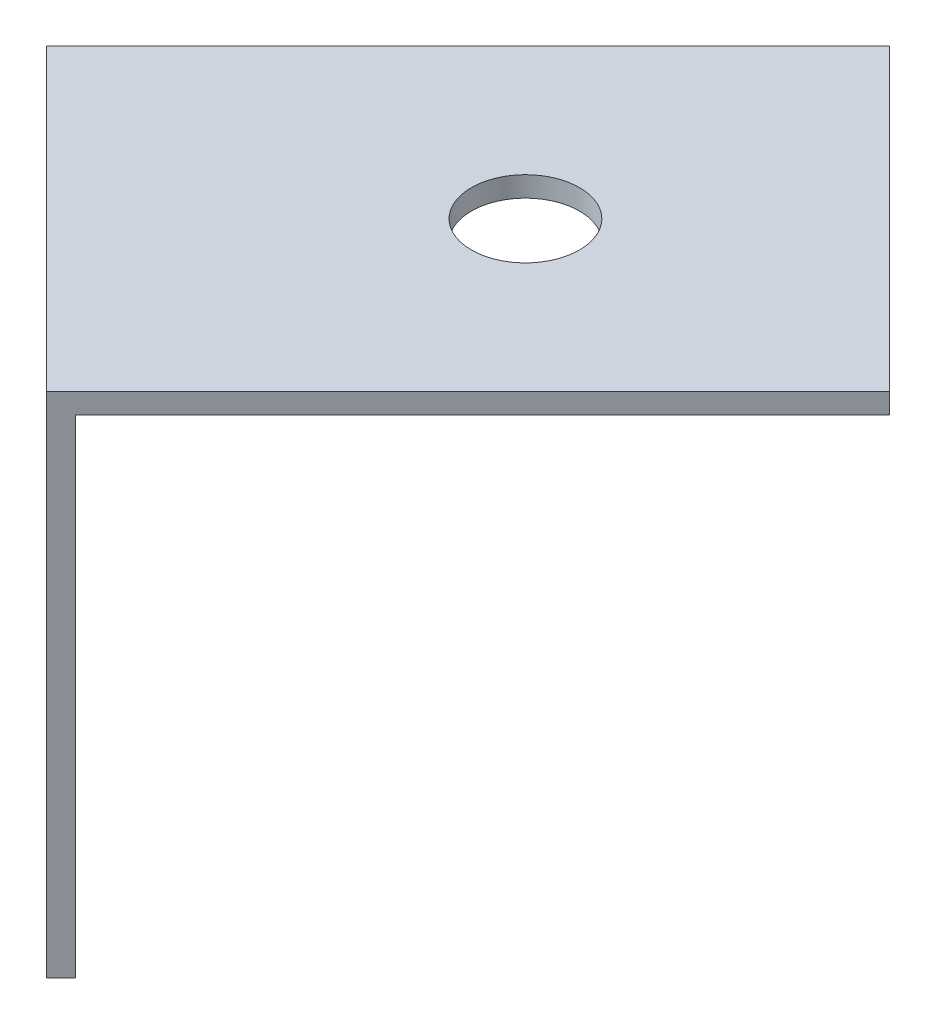
ISO-10303-21;
HEADER;
FILE_DESCRIPTION(('STEP AP214'),'2;1');
FILE_NAME('part.step','',(''),(''),'','','');
FILE_SCHEMA(('AUTOMOTIVE_DESIGN { 1 0 10303 214 1 1 1 1 }'));
ENDSEC;
DATA;
#1=APPLICATION_CONTEXT('core data for automotive mechanical design processes');
#2=APPLICATION_PROTOCOL_DEFINITION('international standard','automotive_design',2000,#1);
#3=PRODUCT_CONTEXT('',#1,'mechanical');
#4=PRODUCT('Part','Part','',(#3));
#5=PRODUCT_RELATED_PRODUCT_CATEGORY('part','',(#4));
#6=PRODUCT_DEFINITION_FORMATION('','',#4);
#7=PRODUCT_DEFINITION_CONTEXT('part definition',#1,'design');
#8=PRODUCT_DEFINITION('design','',#6,#7);
#9=PRODUCT_DEFINITION_SHAPE('','',#8);
#10=(LENGTH_UNIT() NAMED_UNIT(*) SI_UNIT(.MILLI.,.METRE.));
#11=(NAMED_UNIT(*) PLANE_ANGLE_UNIT() SI_UNIT($,.RADIAN.));
#12=(NAMED_UNIT(*) SI_UNIT($,.STERADIAN.) SOLID_ANGLE_UNIT());
#13=UNCERTAINTY_MEASURE_WITH_UNIT(LENGTH_MEASURE(1.E-05),#10,'distance_accuracy_value','');
#14=(GEOMETRIC_REPRESENTATION_CONTEXT(3) GLOBAL_UNCERTAINTY_ASSIGNED_CONTEXT((#13)) GLOBAL_UNIT_ASSIGNED_CONTEXT((#10,
#11,#12)) REPRESENTATION_CONTEXT('',''));
#15=CARTESIAN_POINT('',(0.,0.,0.));
#16=DIRECTION('',(0.,0.,1.));
#17=DIRECTION('',(1.,0.,0.));
#18=AXIS2_PLACEMENT_3D('',#15,#16,#17);
#19=CARTESIAN_POINT('',(-21.7788888605454,0.,21.7788888605459));
#20=DIRECTION('',(-0.707106781186539,0.,0.707106781186556));
#21=DIRECTION('',(0.707106781186556,0.,0.707106781186539));
#22=AXIS2_PLACEMENT_3D('',#19,#20,#21);
#23=PLANE('',#22);
#24=DIRECTION('',(-0.707106781186556,0.,-0.707106781186539));
#25=VECTOR('',#24,1.);
#26=CARTESIAN_POINT('',(-30.6177236253827,-74.2,12.9400540957089));
#27=LINE('',#26,#25);
#28=CARTESIAN_POINT('',(-12.9400540957187,-74.2,30.6177236253724));
#29=VERTEX_POINT('',#28);
#30=CARTESIAN_POINT('',(-30.6177236253827,-74.2,12.9400540957089));
#31=VERTEX_POINT('',#30);
#32=EDGE_CURVE('E52',#29,#31,#27,.T.);
#33=ORIENTED_EDGE('',*,*,#32,.F.);
#34=DIRECTION('',(0.,-1.,0.));
#35=VECTOR('',#34,1.);
#36=CARTESIAN_POINT('',(-12.9400540957187,-73.,30.6177236253724));
#37=LINE('',#36,#35);
#38=CARTESIAN_POINT('',(-12.9400540957188,-103.,30.6177236253723));
#39=VERTEX_POINT('',#38);
#40=EDGE_CURVE('E57',#29,#39,#37,.T.);
#41=ORIENTED_EDGE('',*,*,#40,.T.);
#42=DIRECTION('',(0.707106781186556,0.,0.707106781186539));
#43=VECTOR('',#42,1.);
#44=CARTESIAN_POINT('',(-30.6177236253827,-103.,12.9400540957089));
#45=LINE('',#44,#43);
#46=CARTESIAN_POINT('',(-30.6177236253827,-103.,12.9400540957089));
#47=VERTEX_POINT('',#46);
#48=EDGE_CURVE('E114',#47,#39,#45,.T.);
#49=ORIENTED_EDGE('',*,*,#48,.F.);
#50=DIRECTION('',(0.,-1.,0.));
#51=VECTOR('',#50,1.);
#52=CARTESIAN_POINT('',(-30.6177236253827,-73.,12.9400540957089));
#53=LINE('',#52,#51);
#54=EDGE_CURVE('E96',#31,#47,#53,.T.);
#55=ORIENTED_EDGE('',*,*,#54,.F.);
#56=EDGE_LOOP('',(#33,#41,#49,#55));
#57=FACE_BOUND('',#56,.T.);
#58=ADVANCED_FACE('F35',(#57),#23,.F.);
#59=CARTESIAN_POINT('',(-12.9400540957187,-73.,30.6177236253724));
#60=DIRECTION('',(0.,1.,0.));
#61=DIRECTION('',(0.,0.,1.));
#62=AXIS2_PLACEMENT_3D('',#59,#60,#61);
#63=PLANE('',#62);
#64=CARTESIAN_POINT('',(-8.48528137424377,-73.,8.48528137423338));
#65=DIRECTION('',(0.,1.,0.));
#66=DIRECTION('',(0.,0.,1.));
#67=AXIS2_PLACEMENT_3D('',#64,#65,#66);
#68=CIRCLE('',#67,3.19266946109404);
#69=CARTESIAN_POINT('',(-8.48528137424377,-73.,11.6779508353274));
#70=VERTEX_POINT('',#69);
#71=EDGE_CURVE('E132',#70,#70,#68,.T.);
#72=ORIENTED_EDGE('',*,*,#71,.F.);
#73=EDGE_LOOP('',(#72));
#74=FACE_BOUND('',#73,.T.);
#75=DIRECTION('',(-0.707106781186556,0.,-0.707106781186539));
#76=VECTOR('',#75,1.);
#77=CARTESIAN_POINT('',(-13.7885822331426,-73.,31.4662517627962));
#78=LINE('',#77,#76);
#79=CARTESIAN_POINT('',(-13.7885822331426,-73.,31.4662517627962));
#80=VERTEX_POINT('',#79);
#81=CARTESIAN_POINT('',(-31.4662517628065,-73.,13.7885822331328));
#82=VERTEX_POINT('',#81);
#83=EDGE_CURVE('E93',#80,#82,#78,.T.);
#84=ORIENTED_EDGE('',*,*,#83,.F.);
#85=DIRECTION('',(-0.707106781186539,0.,0.707106781186556));
#86=VECTOR('',#85,1.);
#87=CARTESIAN_POINT('',(-12.9400540957187,-73.,30.6177236253724));
#88=LINE('',#87,#86);
#89=CARTESIAN_POINT('',(11.1015764646236,-73.,6.57609306502946));
#90=VERTEX_POINT('',#89);
#91=EDGE_CURVE('E11',#90,#80,#88,.T.);
#92=ORIENTED_EDGE('',*,*,#91,.F.);
#93=DIRECTION('',(0.707106781186556,0.,0.707106781186539));
#94=VECTOR('',#93,1.);
#95=CARTESIAN_POINT('',(-6.57609306504033,-73.,-11.101576464634));
#96=LINE('',#95,#94);
#97=CARTESIAN_POINT('',(-6.57609306504033,-73.,-11.101576464634));
#98=VERTEX_POINT('',#97);
#99=EDGE_CURVE('E128',#98,#90,#96,.T.);
#100=ORIENTED_EDGE('',*,*,#99,.F.);
#101=DIRECTION('',(-0.707106781186539,0.,0.707106781186556));
#102=VECTOR('',#101,1.);
#103=CARTESIAN_POINT('',(-30.6177236253827,-73.,12.9400540957089));
#104=LINE('',#103,#102);
#105=EDGE_CURVE('E99',#98,#82,#104,.T.);
#106=ORIENTED_EDGE('',*,*,#105,.T.);
#107=EDGE_LOOP('',(#84,#92,#100,#106));
#108=FACE_BOUND('',#107,.T.);
#109=ADVANCED_FACE('F37',(#74,#108),#63,.T.);
#110=CARTESIAN_POINT('',(-12.9400540957187,-73.,30.6177236253724));
#111=DIRECTION('',(-0.707106781186556,0.,-0.707106781186539));
#112=DIRECTION('',(-0.707106781186539,0.,0.707106781186556));
#113=AXIS2_PLACEMENT_3D('',#110,#111,#112);
#114=PLANE('',#113);
#115=DIRECTION('',(0.,-1.,0.));
#116=VECTOR('',#115,1.);
#117=CARTESIAN_POINT('',(-13.7885822331426,-73.,31.4662517627962));
#118=LINE('',#117,#116);
#119=CARTESIAN_POINT('',(-13.7885822331426,-103.,31.4662517627962));
#120=VERTEX_POINT('',#119);
#121=EDGE_CURVE('E79',#80,#120,#118,.T.);
#122=ORIENTED_EDGE('',*,*,#121,.T.);
#123=DIRECTION('',(-0.707106781186539,0.,0.707106781186556));
#124=VECTOR('',#123,1.);
#125=CARTESIAN_POINT('',(-12.9400540957188,-103.,30.6177236253723));
#126=LINE('',#125,#124);
#127=EDGE_CURVE('E44',#39,#120,#126,.T.);
#128=ORIENTED_EDGE('',*,*,#127,.F.);
#129=ORIENTED_EDGE('',*,*,#40,.F.);
#130=DIRECTION('',(-0.707106781186539,0.,0.707106781186556));
#131=VECTOR('',#130,1.);
#132=CARTESIAN_POINT('',(11.1015764646236,-74.2,6.57609306502947));
#133=LINE('',#132,#131);
#134=CARTESIAN_POINT('',(11.1015764646236,-74.2,6.57609306502947));
#135=VERTEX_POINT('',#134);
#136=EDGE_CURVE('E102',#135,#29,#133,.T.);
#137=ORIENTED_EDGE('',*,*,#136,.F.);
#138=DIRECTION('',(0.,-1.,0.));
#139=VECTOR('',#138,1.);
#140=CARTESIAN_POINT('',(11.1015764646236,-73.,6.57609306502946));
#141=LINE('',#140,#139);
#142=EDGE_CURVE('E84',#90,#135,#141,.T.);
#143=ORIENTED_EDGE('',*,*,#142,.F.);
#144=ORIENTED_EDGE('',*,*,#91,.T.);
#145=EDGE_LOOP('',(#122,#128,#129,#137,#143,#144));
#146=FACE_BOUND('',#145,.T.);
#147=ADVANCED_FACE('F78',(#146),#114,.F.);
#148=CARTESIAN_POINT('',(-30.6177236253827,-103.,12.9400540957089));
#149=DIRECTION('',(0.,-1.,0.));
#150=DIRECTION('',(0.,0.,-1.));
#151=AXIS2_PLACEMENT_3D('',#148,#149,#150);
#152=PLANE('',#151);
#153=DIRECTION('',(0.707106781186556,0.,0.707106781186539));
#154=VECTOR('',#153,1.);
#155=CARTESIAN_POINT('',(-31.4662517628065,-103.,13.7885822331327));
#156=LINE('',#155,#154);
#157=CARTESIAN_POINT('',(-31.4662517628065,-103.,13.7885822331327));
#158=VERTEX_POINT('',#157);
#159=EDGE_CURVE('E95',#158,#120,#156,.T.);
#160=ORIENTED_EDGE('',*,*,#159,.F.);
#161=DIRECTION('',(-0.707106781186539,0.,0.707106781186556));
#162=VECTOR('',#161,1.);
#163=CARTESIAN_POINT('',(-30.6177236253827,-103.,12.9400540957089));
#164=LINE('',#163,#162);
#165=EDGE_CURVE('E113',#47,#158,#164,.T.);
#166=ORIENTED_EDGE('',*,*,#165,.F.);
#167=ORIENTED_EDGE('',*,*,#48,.T.);
#168=ORIENTED_EDGE('',*,*,#127,.T.);
#169=EDGE_LOOP('',(#160,#166,#167,#168));
#170=FACE_BOUND('',#169,.T.);
#171=ADVANCED_FACE('F164',(#170),#152,.T.);
#172=CARTESIAN_POINT('',(-30.6177236253827,-73.,12.9400540957089));
#173=DIRECTION('',(-0.707106781186556,0.,-0.707106781186539));
#174=DIRECTION('',(-0.707106781186539,0.,0.707106781186556));
#175=AXIS2_PLACEMENT_3D('',#172,#173,#174);
#176=PLANE('',#175);
#177=DIRECTION('',(0.,-1.,0.));
#178=VECTOR('',#177,1.);
#179=CARTESIAN_POINT('',(-31.4662517628065,-73.,13.7885822331328));
#180=LINE('',#179,#178);
#181=EDGE_CURVE('E101',#82,#158,#180,.T.);
#182=ORIENTED_EDGE('',*,*,#181,.F.);
#183=ORIENTED_EDGE('',*,*,#105,.F.);
#184=DIRECTION('',(0.,1.,0.));
#185=VECTOR('',#184,1.);
#186=CARTESIAN_POINT('',(-6.57609306504033,-73.,-11.101576464634));
#187=LINE('',#186,#185);
#188=CARTESIAN_POINT('',(-6.57609306504033,-74.2,-11.101576464634));
#189=VERTEX_POINT('',#188);
#190=EDGE_CURVE('E124',#189,#98,#187,.T.);
#191=ORIENTED_EDGE('',*,*,#190,.F.);
#192=DIRECTION('',(-0.707106781186539,0.,0.707106781186556));
#193=VECTOR('',#192,1.);
#194=CARTESIAN_POINT('',(-6.57609306504033,-74.2,-11.101576464634));
#195=LINE('',#194,#193);
#196=EDGE_CURVE('E106',#189,#31,#195,.T.);
#197=ORIENTED_EDGE('',*,*,#196,.T.);
#198=ORIENTED_EDGE('',*,*,#54,.T.);
#199=ORIENTED_EDGE('',*,*,#165,.T.);
#200=EDGE_LOOP('',(#182,#183,#191,#197,#198,#199));
#201=FACE_BOUND('',#200,.T.);
#202=ADVANCED_FACE('F161',(#201),#176,.T.);
#203=CARTESIAN_POINT('',(-22.6274169979693,0.,22.6274169979698));
#204=DIRECTION('',(-0.707106781186539,0.,0.707106781186556));
#205=DIRECTION('',(0.707106781186556,0.,0.707106781186539));
#206=AXIS2_PLACEMENT_3D('',#203,#204,#205);
#207=PLANE('',#206);
#208=ORIENTED_EDGE('',*,*,#83,.T.);
#209=ORIENTED_EDGE('',*,*,#181,.T.);
#210=ORIENTED_EDGE('',*,*,#159,.T.);
#211=ORIENTED_EDGE('',*,*,#121,.F.);
#212=EDGE_LOOP('',(#208,#209,#210,#211));
#213=FACE_BOUND('',#212,.T.);
#214=ADVANCED_FACE('F91',(#213),#207,.T.);
#215=CARTESIAN_POINT('',(-6.57609306504033,-74.2,-11.101576464634));
#216=DIRECTION('',(0.,1.,0.));
#217=DIRECTION('',(0.,0.,1.));
#218=AXIS2_PLACEMENT_3D('',#215,#216,#217);
#219=PLANE('',#218);
#220=CARTESIAN_POINT('',(-8.48528137424377,-74.2,8.48528137423338));
#221=DIRECTION('',(0.,1.,0.));
#222=DIRECTION('',(0.,0.,1.));
#223=AXIS2_PLACEMENT_3D('',#220,#221,#222);
#224=CIRCLE('',#223,3.19266946109404);
#225=CARTESIAN_POINT('',(-8.48528137424377,-74.2,11.6779508353274));
#226=VERTEX_POINT('',#225);
#227=EDGE_CURVE('E39',#226,#226,#224,.T.);
#228=ORIENTED_EDGE('',*,*,#227,.T.);
#229=EDGE_LOOP('',(#228));
#230=FACE_BOUND('',#229,.T.);
#231=ORIENTED_EDGE('',*,*,#32,.T.);
#232=ORIENTED_EDGE('',*,*,#196,.F.);
#233=DIRECTION('',(-0.707106781186556,0.,-0.707106781186539));
#234=VECTOR('',#233,1.);
#235=CARTESIAN_POINT('',(-6.57609306504033,-74.2,-11.101576464634));
#236=LINE('',#235,#234);
#237=EDGE_CURVE('E122',#135,#189,#236,.T.);
#238=ORIENTED_EDGE('',*,*,#237,.F.);
#239=ORIENTED_EDGE('',*,*,#136,.T.);
#240=EDGE_LOOP('',(#231,#232,#238,#239));
#241=FACE_BOUND('',#240,.T.);
#242=ADVANCED_FACE('F139',(#230,#241),#219,.F.);
#243=CARTESIAN_POINT('',(2.26274169979692,0.,-2.26274169979698));
#244=DIRECTION('',(-0.707106781186539,0.,0.707106781186556));
#245=DIRECTION('',(0.707106781186556,0.,0.707106781186539));
#246=AXIS2_PLACEMENT_3D('',#243,#244,#245);
#247=PLANE('',#246);
#248=ORIENTED_EDGE('',*,*,#190,.T.);
#249=ORIENTED_EDGE('',*,*,#99,.T.);
#250=ORIENTED_EDGE('',*,*,#142,.T.);
#251=ORIENTED_EDGE('',*,*,#237,.T.);
#252=EDGE_LOOP('',(#248,#249,#250,#251));
#253=FACE_BOUND('',#252,.T.);
#254=ADVANCED_FACE('F144',(#253),#247,.F.);
#255=CARTESIAN_POINT('',(-8.48528137424377,-77.,8.48528137423338));
#256=DIRECTION('',(0.,1.,0.));
#257=DIRECTION('',(0.,0.,1.));
#258=AXIS2_PLACEMENT_3D('',#255,#256,#257);
#259=CYLINDRICAL_SURFACE('',#258,3.19266946109404);
#260=ORIENTED_EDGE('',*,*,#71,.T.);
#261=EDGE_LOOP('',(#260));
#262=FACE_BOUND('',#261,.T.);
#263=ORIENTED_EDGE('',*,*,#227,.F.);
#264=EDGE_LOOP('',(#263));
#265=FACE_BOUND('',#264,.T.);
#266=ADVANCED_FACE('F142',(#262,#265),#259,.F.);
#267=CLOSED_SHELL('',(#58,#109,#147,#171,#202,#214,#242,#254,#266));
#268=MANIFOLD_SOLID_BREP('B2',#267);
#269=ADVANCED_BREP_SHAPE_REPRESENTATION('',(#18,#268),#14);
#270=SHAPE_DEFINITION_REPRESENTATION(#9,#269);
ENDSEC;
END-ISO-10303-21;
